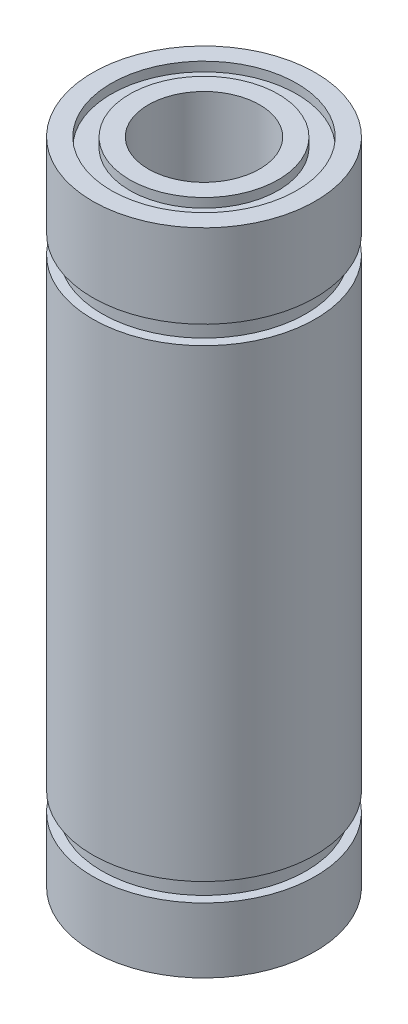
ISO-10303-21;
HEADER;
FILE_DESCRIPTION(('STEP AP214'),'2;1');
FILE_NAME('part.step','',(''),(''),'','','');
FILE_SCHEMA(('AUTOMOTIVE_DESIGN { 1 0 10303 214 1 1 1 1 }'));
ENDSEC;
DATA;
#1=APPLICATION_CONTEXT('core data for automotive mechanical design processes');
#2=APPLICATION_PROTOCOL_DEFINITION('international standard','automotive_design',2000,#1);
#3=PRODUCT_CONTEXT('',#1,'mechanical');
#4=PRODUCT('Part','Part','',(#3));
#5=PRODUCT_RELATED_PRODUCT_CATEGORY('part','',(#4));
#6=PRODUCT_DEFINITION_FORMATION('','',#4);
#7=PRODUCT_DEFINITION_CONTEXT('part definition',#1,'design');
#8=PRODUCT_DEFINITION('design','',#6,#7);
#9=PRODUCT_DEFINITION_SHAPE('','',#8);
#10=(LENGTH_UNIT() NAMED_UNIT(*) SI_UNIT(.MILLI.,.METRE.));
#11=(NAMED_UNIT(*) PLANE_ANGLE_UNIT() SI_UNIT($,.RADIAN.));
#12=(NAMED_UNIT(*) SI_UNIT($,.STERADIAN.) SOLID_ANGLE_UNIT());
#13=UNCERTAINTY_MEASURE_WITH_UNIT(LENGTH_MEASURE(1.E-05),#10,'distance_accuracy_value','');
#14=(GEOMETRIC_REPRESENTATION_CONTEXT(3) GLOBAL_UNCERTAINTY_ASSIGNED_CONTEXT((#13)) GLOBAL_UNIT_ASSIGNED_CONTEXT((#10,
#11,#12)) REPRESENTATION_CONTEXT('',''));
#15=CARTESIAN_POINT('',(0.,0.,0.));
#16=DIRECTION('',(0.,0.,1.));
#17=DIRECTION('',(1.,0.,0.));
#18=AXIS2_PLACEMENT_3D('',#15,#16,#17);
#19=CARTESIAN_POINT('',(0.,17500.,0.));
#20=DIRECTION('',(0.,-1.,0.));
#21=DIRECTION('',(0.,0.,-1.));
#22=AXIS2_PLACEMENT_3D('',#19,#20,#21);
#23=CYLINDRICAL_SURFACE('',#22,6000.);
#24=CARTESIAN_POINT('',(0.,-17500.,0.));
#25=DIRECTION('',(0.,1.,0.));
#26=DIRECTION('',(0.,0.,1.));
#27=AXIS2_PLACEMENT_3D('',#24,#25,#26);
#28=CIRCLE('',#27,6000.);
#29=CARTESIAN_POINT('',(0.,-17500.,6000.));
#30=VERTEX_POINT('',#29);
#31=EDGE_CURVE('E49',#30,#30,#28,.T.);
#32=ORIENTED_EDGE('',*,*,#31,.T.);
#33=EDGE_LOOP('',(#32));
#34=FACE_BOUND('',#33,.T.);
#35=CARTESIAN_POINT('',(0.,-14000.,0.));
#36=DIRECTION('',(0.,1.,0.));
#37=DIRECTION('',(0.,0.,1.));
#38=AXIS2_PLACEMENT_3D('',#35,#36,#37);
#39=CIRCLE('',#38,6000.);
#40=CARTESIAN_POINT('',(0.,-14000.,6000.));
#41=VERTEX_POINT('',#40);
#42=EDGE_CURVE('E188',#41,#41,#39,.T.);
#43=ORIENTED_EDGE('',*,*,#42,.F.);
#44=EDGE_LOOP('',(#43));
#45=FACE_BOUND('',#44,.T.);
#46=ADVANCED_FACE('F33',(#34,#45),#23,.T.);
#47=CARTESIAN_POINT('',(0.,-13000.,0.));
#48=DIRECTION('',(0.,1.,0.));
#49=DIRECTION('',(0.,0.,1.));
#50=AXIS2_PLACEMENT_3D('',#47,#48,#49);
#51=CIRCLE('',#50,6000.);
#52=CARTESIAN_POINT('',(0.,-13000.,6000.));
#53=VERTEX_POINT('',#52);
#54=EDGE_CURVE('E185',#53,#53,#51,.T.);
#55=ORIENTED_EDGE('',*,*,#54,.T.);
#56=EDGE_LOOP('',(#55));
#57=FACE_BOUND('',#56,.T.);
#58=CARTESIAN_POINT('',(0.,12000.,0.));
#59=DIRECTION('',(0.,1.,0.));
#60=DIRECTION('',(0.,0.,1.));
#61=AXIS2_PLACEMENT_3D('',#58,#59,#60);
#62=CIRCLE('',#61,6000.);
#63=CARTESIAN_POINT('',(0.,12000.,6000.));
#64=VERTEX_POINT('',#63);
#65=EDGE_CURVE('E95',#64,#64,#62,.T.);
#66=ORIENTED_EDGE('',*,*,#65,.F.);
#67=EDGE_LOOP('',(#66));
#68=FACE_BOUND('',#67,.T.);
#69=ADVANCED_FACE('F78',(#57,#68),#23,.T.);
#70=CARTESIAN_POINT('',(0.,17500.,0.));
#71=DIRECTION('',(0.,-1.,0.));
#72=DIRECTION('',(0.,0.,-1.));
#73=AXIS2_PLACEMENT_3D('',#70,#71,#72);
#74=CYLINDRICAL_SURFACE('',#73,5000.);
#75=CARTESIAN_POINT('',(0.,-17500.,0.));
#76=DIRECTION('',(0.,1.,0.));
#77=DIRECTION('',(0.,0.,1.));
#78=AXIS2_PLACEMENT_3D('',#75,#76,#77);
#79=CIRCLE('',#78,5000.);
#80=CARTESIAN_POINT('',(0.,-17500.,5000.));
#81=VERTEX_POINT('',#80);
#82=EDGE_CURVE('E53',#81,#81,#79,.T.);
#83=ORIENTED_EDGE('',*,*,#82,.F.);
#84=EDGE_LOOP('',(#83));
#85=FACE_BOUND('',#84,.T.);
#86=CARTESIAN_POINT('',(0.,-17000.,0.));
#87=DIRECTION('',(0.,1.,0.));
#88=DIRECTION('',(0.,0.,1.));
#89=AXIS2_PLACEMENT_3D('',#86,#87,#88);
#90=CIRCLE('',#89,5000.);
#91=CARTESIAN_POINT('',(0.,-17000.,5000.));
#92=VERTEX_POINT('',#91);
#93=EDGE_CURVE('E120',#92,#92,#90,.T.);
#94=ORIENTED_EDGE('',*,*,#93,.T.);
#95=EDGE_LOOP('',(#94));
#96=FACE_BOUND('',#95,.T.);
#97=ADVANCED_FACE('F82',(#85,#96),#74,.F.);
#98=CARTESIAN_POINT('',(0.,17000.,0.));
#99=DIRECTION('',(0.,1.,0.));
#100=DIRECTION('',(0.,0.,1.));
#101=AXIS2_PLACEMENT_3D('',#98,#99,#100);
#102=CIRCLE('',#101,5000.);
#103=CARTESIAN_POINT('',(0.,17000.,5000.));
#104=VERTEX_POINT('',#103);
#105=EDGE_CURVE('E10',#104,#104,#102,.T.);
#106=ORIENTED_EDGE('',*,*,#105,.F.);
#107=EDGE_LOOP('',(#106));
#108=FACE_BOUND('',#107,.T.);
#109=CARTESIAN_POINT('',(0.,17500.,0.));
#110=DIRECTION('',(0.,1.,0.));
#111=DIRECTION('',(0.,0.,1.));
#112=AXIS2_PLACEMENT_3D('',#109,#110,#111);
#113=CIRCLE('',#112,5000.);
#114=CARTESIAN_POINT('',(0.,17500.,5000.));
#115=VERTEX_POINT('',#114);
#116=EDGE_CURVE('E44',#115,#115,#113,.T.);
#117=ORIENTED_EDGE('',*,*,#116,.T.);
#118=EDGE_LOOP('',(#117));
#119=FACE_BOUND('',#118,.T.);
#120=ADVANCED_FACE('F35',(#108,#119),#74,.F.);
#121=CARTESIAN_POINT('',(0.,13000.,0.));
#122=DIRECTION('',(0.,1.,0.));
#123=DIRECTION('',(0.,0.,1.));
#124=AXIS2_PLACEMENT_3D('',#121,#122,#123);
#125=CIRCLE('',#124,6000.);
#126=CARTESIAN_POINT('',(0.,13000.,6000.));
#127=VERTEX_POINT('',#126);
#128=EDGE_CURVE('E93',#127,#127,#125,.T.);
#129=ORIENTED_EDGE('',*,*,#128,.T.);
#130=EDGE_LOOP('',(#129));
#131=FACE_BOUND('',#130,.T.);
#132=CARTESIAN_POINT('',(0.,17500.,0.));
#133=DIRECTION('',(0.,1.,0.));
#134=DIRECTION('',(0.,0.,1.));
#135=AXIS2_PLACEMENT_3D('',#132,#133,#134);
#136=CIRCLE('',#135,6000.);
#137=CARTESIAN_POINT('',(0.,17500.,6000.));
#138=VERTEX_POINT('',#137);
#139=EDGE_CURVE('E40',#138,#138,#136,.T.);
#140=ORIENTED_EDGE('',*,*,#139,.F.);
#141=EDGE_LOOP('',(#140));
#142=FACE_BOUND('',#141,.T.);
#143=ADVANCED_FACE('F74',(#131,#142),#23,.T.);
#144=CARTESIAN_POINT('',(0.,17500.,0.));
#145=DIRECTION('',(0.,1.,0.));
#146=DIRECTION('',(0.,0.,1.));
#147=AXIS2_PLACEMENT_3D('',#144,#145,#146);
#148=PLANE('',#147);
#149=ORIENTED_EDGE('',*,*,#116,.F.);
#150=EDGE_LOOP('',(#149));
#151=FACE_BOUND('',#150,.T.);
#152=ORIENTED_EDGE('',*,*,#139,.T.);
#153=EDGE_LOOP('',(#152));
#154=FACE_BOUND('',#153,.T.);
#155=ADVANCED_FACE('F64',(#151,#154),#148,.T.);
#156=CARTESIAN_POINT('',(0.,-17500.,0.));
#157=DIRECTION('',(0.,1.,0.));
#158=DIRECTION('',(0.,0.,1.));
#159=AXIS2_PLACEMENT_3D('',#156,#157,#158);
#160=PLANE('',#159);
#161=ORIENTED_EDGE('',*,*,#82,.T.);
#162=EDGE_LOOP('',(#161));
#163=FACE_BOUND('',#162,.T.);
#164=ORIENTED_EDGE('',*,*,#31,.F.);
#165=EDGE_LOOP('',(#164));
#166=FACE_BOUND('',#165,.T.);
#167=ADVANCED_FACE('F61',(#163,#166),#160,.F.);
#168=CARTESIAN_POINT('',(0.,17000.,0.));
#169=DIRECTION('',(0.,1.,0.));
#170=DIRECTION('',(0.,0.,1.));
#171=AXIS2_PLACEMENT_3D('',#168,#169,#170);
#172=PLANE('',#171);
#173=CARTESIAN_POINT('',(0.,17000.,0.));
#174=DIRECTION('',(0.,1.,0.));
#175=DIRECTION('',(0.,0.,1.));
#176=AXIS2_PLACEMENT_3D('',#173,#174,#175);
#177=CIRCLE('',#176,4000.);
#178=CARTESIAN_POINT('',(0.,17000.,4000.));
#179=VERTEX_POINT('',#178);
#180=EDGE_CURVE('E55',#179,#179,#177,.T.);
#181=ORIENTED_EDGE('',*,*,#180,.F.);
#182=EDGE_LOOP('',(#181));
#183=FACE_BOUND('',#182,.T.);
#184=ORIENTED_EDGE('',*,*,#105,.T.);
#185=EDGE_LOOP('',(#184));
#186=FACE_BOUND('',#185,.T.);
#187=ADVANCED_FACE('F63',(#183,#186),#172,.T.);
#188=CARTESIAN_POINT('',(0.,-17000.,0.));
#189=DIRECTION('',(0.,1.,0.));
#190=DIRECTION('',(0.,0.,1.));
#191=AXIS2_PLACEMENT_3D('',#188,#189,#190);
#192=PLANE('',#191);
#193=CARTESIAN_POINT('',(0.,-17000.,0.));
#194=DIRECTION('',(0.,1.,0.));
#195=DIRECTION('',(0.,0.,1.));
#196=AXIS2_PLACEMENT_3D('',#193,#194,#195);
#197=CIRCLE('',#196,4000.);
#198=CARTESIAN_POINT('',(0.,-17000.,4000.));
#199=VERTEX_POINT('',#198);
#200=EDGE_CURVE('E113',#199,#199,#197,.F.);
#201=ORIENTED_EDGE('',*,*,#200,.F.);
#202=EDGE_LOOP('',(#201));
#203=FACE_BOUND('',#202,.T.);
#204=ORIENTED_EDGE('',*,*,#93,.F.);
#205=EDGE_LOOP('',(#204));
#206=FACE_BOUND('',#205,.T.);
#207=ADVANCED_FACE('F71',(#203,#206),#192,.F.);
#208=CARTESIAN_POINT('',(0.,17500.,0.));
#209=DIRECTION('',(0.,-1.,0.));
#210=DIRECTION('',(0.,0.,-1.));
#211=AXIS2_PLACEMENT_3D('',#208,#209,#210);
#212=CYLINDRICAL_SURFACE('',#211,4000.);
#213=CARTESIAN_POINT('',(0.,-17500.,0.));
#214=DIRECTION('',(0.,1.,0.));
#215=DIRECTION('',(0.,0.,1.));
#216=AXIS2_PLACEMENT_3D('',#213,#214,#215);
#217=CIRCLE('',#216,4000.);
#218=CARTESIAN_POINT('',(0.,-17500.,4000.));
#219=VERTEX_POINT('',#218);
#220=EDGE_CURVE('E110',#219,#219,#217,.T.);
#221=ORIENTED_EDGE('',*,*,#220,.T.);
#222=EDGE_LOOP('',(#221));
#223=FACE_BOUND('',#222,.T.);
#224=ORIENTED_EDGE('',*,*,#200,.T.);
#225=EDGE_LOOP('',(#224));
#226=FACE_BOUND('',#225,.T.);
#227=ADVANCED_FACE('F127',(#223,#226),#212,.T.);
#228=CARTESIAN_POINT('',(0.,17500.,0.));
#229=DIRECTION('',(0.,-1.,0.));
#230=DIRECTION('',(0.,0.,-1.));
#231=AXIS2_PLACEMENT_3D('',#228,#229,#230);
#232=CYLINDRICAL_SURFACE('',#231,3000.);
#233=CARTESIAN_POINT('',(0.,17500.,0.));
#234=DIRECTION('',(0.,1.,0.));
#235=DIRECTION('',(0.,0.,1.));
#236=AXIS2_PLACEMENT_3D('',#233,#234,#235);
#237=CIRCLE('',#236,3000.);
#238=CARTESIAN_POINT('',(0.,17500.,3000.));
#239=VERTEX_POINT('',#238);
#240=EDGE_CURVE('E106',#239,#239,#237,.T.);
#241=ORIENTED_EDGE('',*,*,#240,.T.);
#242=EDGE_LOOP('',(#241));
#243=FACE_BOUND('',#242,.T.);
#244=CARTESIAN_POINT('',(0.,-17500.,0.));
#245=DIRECTION('',(0.,1.,0.));
#246=DIRECTION('',(0.,0.,1.));
#247=AXIS2_PLACEMENT_3D('',#244,#245,#246);
#248=CIRCLE('',#247,3000.);
#249=CARTESIAN_POINT('',(0.,-17500.,3000.));
#250=VERTEX_POINT('',#249);
#251=EDGE_CURVE('E99',#250,#250,#248,.T.);
#252=ORIENTED_EDGE('',*,*,#251,.F.);
#253=EDGE_LOOP('',(#252));
#254=FACE_BOUND('',#253,.T.);
#255=ADVANCED_FACE('F133',(#243,#254),#232,.F.);
#256=ORIENTED_EDGE('',*,*,#180,.T.);
#257=EDGE_LOOP('',(#256));
#258=FACE_BOUND('',#257,.T.);
#259=CARTESIAN_POINT('',(0.,17500.,0.));
#260=DIRECTION('',(0.,1.,0.));
#261=DIRECTION('',(0.,0.,1.));
#262=AXIS2_PLACEMENT_3D('',#259,#260,#261);
#263=CIRCLE('',#262,4000.);
#264=CARTESIAN_POINT('',(0.,17500.,4000.));
#265=VERTEX_POINT('',#264);
#266=EDGE_CURVE('E109',#265,#265,#263,.T.);
#267=ORIENTED_EDGE('',*,*,#266,.F.);
#268=EDGE_LOOP('',(#267));
#269=FACE_BOUND('',#268,.T.);
#270=ADVANCED_FACE('F136',(#258,#269),#212,.T.);
#271=CARTESIAN_POINT('',(0.,17500.,0.));
#272=DIRECTION('',(0.,1.,0.));
#273=DIRECTION('',(0.,0.,1.));
#274=AXIS2_PLACEMENT_3D('',#271,#272,#273);
#275=PLANE('',#274);
#276=ORIENTED_EDGE('',*,*,#240,.F.);
#277=EDGE_LOOP('',(#276));
#278=FACE_BOUND('',#277,.T.);
#279=ORIENTED_EDGE('',*,*,#266,.T.);
#280=EDGE_LOOP('',(#279));
#281=FACE_BOUND('',#280,.T.);
#282=ADVANCED_FACE('F143',(#278,#281),#275,.T.);
#283=CARTESIAN_POINT('',(0.,-17500.,0.));
#284=DIRECTION('',(0.,1.,0.));
#285=DIRECTION('',(0.,0.,1.));
#286=AXIS2_PLACEMENT_3D('',#283,#284,#285);
#287=PLANE('',#286);
#288=ORIENTED_EDGE('',*,*,#251,.T.);
#289=EDGE_LOOP('',(#288));
#290=FACE_BOUND('',#289,.T.);
#291=ORIENTED_EDGE('',*,*,#220,.F.);
#292=EDGE_LOOP('',(#291));
#293=FACE_BOUND('',#292,.T.);
#294=ADVANCED_FACE('F145',(#290,#293),#287,.F.);
#295=CARTESIAN_POINT('',(0.,12000.,0.));
#296=DIRECTION('',(0.,1.,0.));
#297=DIRECTION('',(0.,0.,1.));
#298=AXIS2_PLACEMENT_3D('',#295,#296,#297);
#299=PLANE('',#298);
#300=CARTESIAN_POINT('',(0.,12000.,0.));
#301=DIRECTION('',(0.,1.,0.));
#302=DIRECTION('',(0.,0.,1.));
#303=AXIS2_PLACEMENT_3D('',#300,#301,#302);
#304=CIRCLE('',#303,5500.);
#305=CARTESIAN_POINT('',(0.,12000.,5500.));
#306=VERTEX_POINT('',#305);
#307=EDGE_CURVE('E96',#306,#306,#304,.T.);
#308=ORIENTED_EDGE('',*,*,#307,.F.);
#309=EDGE_LOOP('',(#308));
#310=FACE_BOUND('',#309,.T.);
#311=ORIENTED_EDGE('',*,*,#65,.T.);
#312=EDGE_LOOP('',(#311));
#313=FACE_BOUND('',#312,.T.);
#314=ADVANCED_FACE('F148',(#310,#313),#299,.T.);
#315=CARTESIAN_POINT('',(0.,13000.,0.));
#316=DIRECTION('',(0.,1.,0.));
#317=DIRECTION('',(0.,0.,1.));
#318=AXIS2_PLACEMENT_3D('',#315,#316,#317);
#319=PLANE('',#318);
#320=CARTESIAN_POINT('',(0.,13000.,0.));
#321=DIRECTION('',(0.,1.,0.));
#322=DIRECTION('',(0.,0.,1.));
#323=AXIS2_PLACEMENT_3D('',#320,#321,#322);
#324=CIRCLE('',#323,5500.);
#325=CARTESIAN_POINT('',(0.,13000.,5500.));
#326=VERTEX_POINT('',#325);
#327=EDGE_CURVE('E102',#326,#326,#324,.T.);
#328=ORIENTED_EDGE('',*,*,#327,.T.);
#329=EDGE_LOOP('',(#328));
#330=FACE_BOUND('',#329,.T.);
#331=ORIENTED_EDGE('',*,*,#128,.F.);
#332=EDGE_LOOP('',(#331));
#333=FACE_BOUND('',#332,.T.);
#334=ADVANCED_FACE('F153',(#330,#333),#319,.F.);
#335=CARTESIAN_POINT('',(0.,12000.,0.));
#336=DIRECTION('',(0.,1.,0.));
#337=DIRECTION('',(0.,0.,1.));
#338=AXIS2_PLACEMENT_3D('',#335,#336,#337);
#339=CYLINDRICAL_SURFACE('',#338,5500.);
#340=ORIENTED_EDGE('',*,*,#307,.T.);
#341=EDGE_LOOP('',(#340));
#342=FACE_BOUND('',#341,.T.);
#343=ORIENTED_EDGE('',*,*,#327,.F.);
#344=EDGE_LOOP('',(#343));
#345=FACE_BOUND('',#344,.T.);
#346=ADVANCED_FACE('F156',(#342,#345),#339,.T.);
#347=CARTESIAN_POINT('',(0.,-14000.,0.));
#348=DIRECTION('',(0.,1.,0.));
#349=DIRECTION('',(0.,0.,1.));
#350=AXIS2_PLACEMENT_3D('',#347,#348,#349);
#351=PLANE('',#350);
#352=CARTESIAN_POINT('',(0.,-14000.,0.));
#353=DIRECTION('',(0.,1.,0.));
#354=DIRECTION('',(0.,0.,1.));
#355=AXIS2_PLACEMENT_3D('',#352,#353,#354);
#356=CIRCLE('',#355,5500.);
#357=CARTESIAN_POINT('',(0.,-14000.,5500.));
#358=VERTEX_POINT('',#357);
#359=EDGE_CURVE('E180',#358,#358,#356,.T.);
#360=ORIENTED_EDGE('',*,*,#359,.F.);
#361=EDGE_LOOP('',(#360));
#362=FACE_BOUND('',#361,.T.);
#363=ORIENTED_EDGE('',*,*,#42,.T.);
#364=EDGE_LOOP('',(#363));
#365=FACE_BOUND('',#364,.T.);
#366=ADVANCED_FACE('F163',(#362,#365),#351,.T.);
#367=CARTESIAN_POINT('',(0.,-13000.,0.));
#368=DIRECTION('',(0.,1.,0.));
#369=DIRECTION('',(0.,0.,1.));
#370=AXIS2_PLACEMENT_3D('',#367,#368,#369);
#371=PLANE('',#370);
#372=CARTESIAN_POINT('',(0.,-13000.,0.));
#373=DIRECTION('',(0.,1.,0.));
#374=DIRECTION('',(0.,0.,1.));
#375=AXIS2_PLACEMENT_3D('',#372,#373,#374);
#376=CIRCLE('',#375,5500.);
#377=CARTESIAN_POINT('',(0.,-13000.,5500.));
#378=VERTEX_POINT('',#377);
#379=EDGE_CURVE('E183',#378,#378,#376,.T.);
#380=ORIENTED_EDGE('',*,*,#379,.T.);
#381=EDGE_LOOP('',(#380));
#382=FACE_BOUND('',#381,.T.);
#383=ORIENTED_EDGE('',*,*,#54,.F.);
#384=EDGE_LOOP('',(#383));
#385=FACE_BOUND('',#384,.T.);
#386=ADVANCED_FACE('F165',(#382,#385),#371,.F.);
#387=CARTESIAN_POINT('',(0.,-14000.,0.));
#388=DIRECTION('',(0.,1.,0.));
#389=DIRECTION('',(0.,0.,1.));
#390=AXIS2_PLACEMENT_3D('',#387,#388,#389);
#391=CYLINDRICAL_SURFACE('',#390,5500.);
#392=ORIENTED_EDGE('',*,*,#359,.T.);
#393=EDGE_LOOP('',(#392));
#394=FACE_BOUND('',#393,.T.);
#395=ORIENTED_EDGE('',*,*,#379,.F.);
#396=EDGE_LOOP('',(#395));
#397=FACE_BOUND('',#396,.T.);
#398=ADVANCED_FACE('F168',(#394,#397),#391,.T.);
#399=CLOSED_SHELL('',(#46,#69,#97,#120,#143,#155,#167,#187,#207,#227,#255,#270,#282,#294,#314,
#334,#346,#366,#386,#398));
#400=MANIFOLD_SOLID_BREP('B2',#399);
#401=ADVANCED_BREP_SHAPE_REPRESENTATION('',(#18,#400),#14);
#402=SHAPE_DEFINITION_REPRESENTATION(#9,#401);
ENDSEC;
END-ISO-10303-21;
